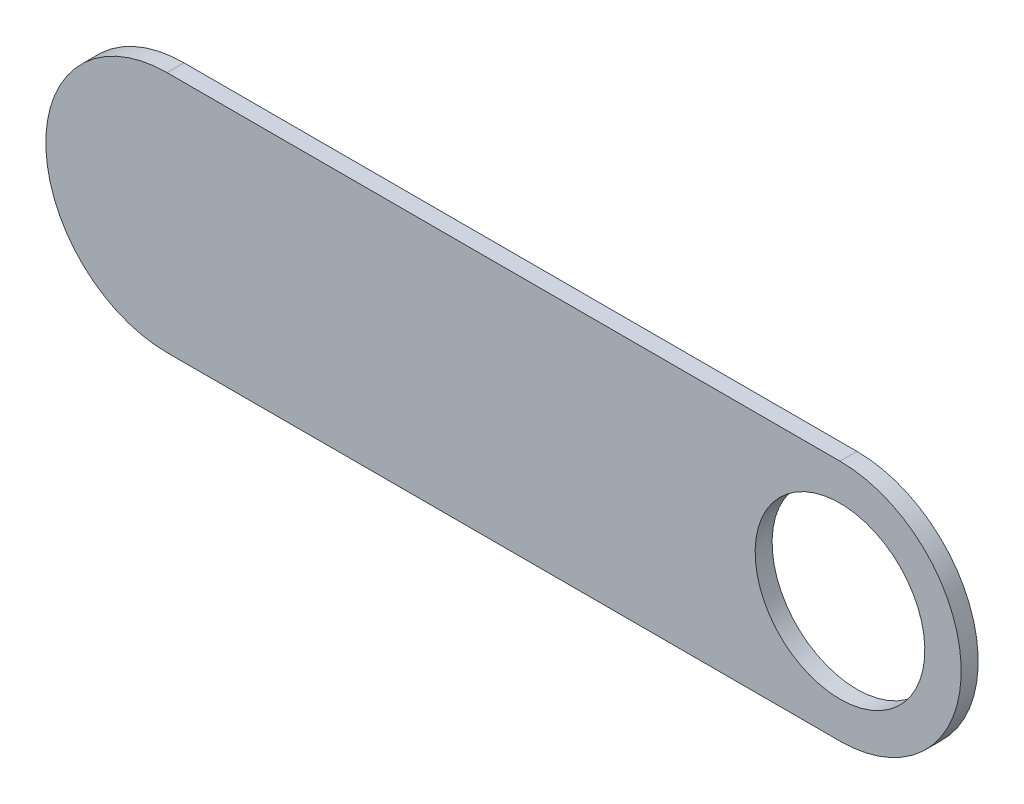
ISO-10303-21;
HEADER;
FILE_DESCRIPTION(('STEP AP214'),'2;1');
FILE_NAME('part.step','',(''),(''),'','','');
FILE_SCHEMA(('AUTOMOTIVE_DESIGN { 1 0 10303 214 1 1 1 1 }'));
ENDSEC;
DATA;
#1=APPLICATION_CONTEXT('core data for automotive mechanical design processes');
#2=APPLICATION_PROTOCOL_DEFINITION('international standard','automotive_design',2000,#1);
#3=PRODUCT_CONTEXT('',#1,'mechanical');
#4=PRODUCT('Part','Part','',(#3));
#5=PRODUCT_RELATED_PRODUCT_CATEGORY('part','',(#4));
#6=PRODUCT_DEFINITION_FORMATION('','',#4);
#7=PRODUCT_DEFINITION_CONTEXT('part definition',#1,'design');
#8=PRODUCT_DEFINITION('design','',#6,#7);
#9=PRODUCT_DEFINITION_SHAPE('','',#8);
#10=(LENGTH_UNIT() NAMED_UNIT(*) SI_UNIT(.MILLI.,.METRE.));
#11=(NAMED_UNIT(*) PLANE_ANGLE_UNIT() SI_UNIT($,.RADIAN.));
#12=(NAMED_UNIT(*) SI_UNIT($,.STERADIAN.) SOLID_ANGLE_UNIT());
#13=UNCERTAINTY_MEASURE_WITH_UNIT(LENGTH_MEASURE(1.E-05),#10,'distance_accuracy_value','');
#14=(GEOMETRIC_REPRESENTATION_CONTEXT(3) GLOBAL_UNCERTAINTY_ASSIGNED_CONTEXT((#13)) GLOBAL_UNIT_ASSIGNED_CONTEXT((#10,
#11,#12)) REPRESENTATION_CONTEXT('',''));
#15=CARTESIAN_POINT('',(0.,0.,0.));
#16=DIRECTION('',(0.,0.,1.));
#17=DIRECTION('',(1.,0.,0.));
#18=AXIS2_PLACEMENT_3D('',#15,#16,#17);
#19=CARTESIAN_POINT('',(132.898812,-72.391188,-0.045));
#20=DIRECTION('',(0.,0.,-1.));
#21=DIRECTION('',(-1.624097681738E-13,-1.,0.));
#22=AXIS2_PLACEMENT_3D('',#19,#20,#21);
#23=CYLINDRICAL_SURFACE('',#22,0.175);
#24=CARTESIAN_POINT('',(132.898812,-72.391188,1.6));
#25=DIRECTION('',(0.,0.,-1.));
#26=DIRECTION('',(-1.624097681738E-13,-1.,0.));
#27=AXIS2_PLACEMENT_3D('',#24,#25,#26);
#28=CIRCLE('',#27,0.175);
#29=CARTESIAN_POINT('',(132.898812,-72.566188,1.6));
#30=VERTEX_POINT('',#29);
#31=EDGE_CURVE('E75',#30,#30,#28,.T.);
#32=ORIENTED_EDGE('',*,*,#31,.T.);
#33=DIRECTION('',(0.,0.,1.));
#34=VECTOR('',#33,1.);
#35=CARTESIAN_POINT('',(132.898812,-72.566188,-0.045));
#36=LINE('',#35,#34);
#37=CARTESIAN_POINT('',(132.898812,-72.566188,1.635));
#38=VERTEX_POINT('',#37);
#39=EDGE_CURVE('E11',#30,#38,#36,.T.);
#40=ORIENTED_EDGE('',*,*,#39,.T.);
#41=CARTESIAN_POINT('',(132.898812,-72.391188,1.635));
#42=DIRECTION('',(0.,0.,-1.));
#43=DIRECTION('',(-1.624097681738E-13,-1.,0.));
#44=AXIS2_PLACEMENT_3D('',#41,#42,#43);
#45=CIRCLE('',#44,0.175);
#46=EDGE_CURVE('E20',#38,#38,#45,.T.);
#47=ORIENTED_EDGE('',*,*,#46,.F.);
#48=ORIENTED_EDGE('',*,*,#39,.F.);
#49=EDGE_LOOP('',(#32,#40,#47,#48));
#50=FACE_BOUND('',#49,.T.);
#51=ADVANCED_FACE('F17',(#50),#23,.F.);
#52=CARTESIAN_POINT('',(131.511188,-72.641188,1.6));
#53=DIRECTION('',(0.,1.,0.));
#54=DIRECTION('',(1.,0.,0.));
#55=AXIS2_PLACEMENT_3D('',#52,#53,#54);
#56=PLANE('',#55);
#57=DIRECTION('',(1.,0.,0.));
#58=VECTOR('',#57,1.);
#59=CARTESIAN_POINT('',(131.511188,-72.641188,1.6));
#60=LINE('',#59,#58);
#61=CARTESIAN_POINT('',(131.511188,-72.641188,1.6));
#62=VERTEX_POINT('',#61);
#63=CARTESIAN_POINT('',(132.898812,-72.641188,1.6));
#64=VERTEX_POINT('',#63);
#65=EDGE_CURVE('E56',#62,#64,#60,.T.);
#66=ORIENTED_EDGE('',*,*,#65,.T.);
#67=DIRECTION('',(0.,0.,1.));
#68=VECTOR('',#67,1.);
#69=CARTESIAN_POINT('',(132.898812,-72.641188,1.6));
#70=LINE('',#69,#68);
#71=CARTESIAN_POINT('',(132.898812,-72.641188,1.635));
#72=VERTEX_POINT('',#71);
#73=EDGE_CURVE('E70',#64,#72,#70,.T.);
#74=ORIENTED_EDGE('',*,*,#73,.T.);
#75=DIRECTION('',(1.,0.,0.));
#76=VECTOR('',#75,1.);
#77=CARTESIAN_POINT('',(131.511188,-72.641188,1.635));
#78=LINE('',#77,#76);
#79=CARTESIAN_POINT('',(131.511188,-72.641188,1.635));
#80=VERTEX_POINT('',#79);
#81=EDGE_CURVE('E63',#80,#72,#78,.T.);
#82=ORIENTED_EDGE('',*,*,#81,.F.);
#83=DIRECTION('',(0.,0.,1.));
#84=VECTOR('',#83,1.);
#85=CARTESIAN_POINT('',(131.511188,-72.641188,1.6));
#86=LINE('',#85,#84);
#87=EDGE_CURVE('E67',#62,#80,#86,.T.);
#88=ORIENTED_EDGE('',*,*,#87,.F.);
#89=EDGE_LOOP('',(#66,#74,#82,#88));
#90=FACE_BOUND('',#89,.T.);
#91=ADVANCED_FACE('F65',(#90),#56,.F.);
#92=CARTESIAN_POINT('',(132.898812,-72.141188,1.635));
#93=DIRECTION('',(0.,0.,1.));
#94=DIRECTION('',(1.,0.,0.));
#95=AXIS2_PLACEMENT_3D('',#92,#93,#94);
#96=PLANE('',#95);
#97=ORIENTED_EDGE('',*,*,#46,.T.);
#98=EDGE_LOOP('',(#97));
#99=FACE_BOUND('',#98,.T.);
#100=DIRECTION('',(-1.,0.,0.));
#101=VECTOR('',#100,1.);
#102=CARTESIAN_POINT('',(132.898812,-72.141188,1.635));
#103=LINE('',#102,#101);
#104=CARTESIAN_POINT('',(132.898812,-72.141188,1.635));
#105=VERTEX_POINT('',#104);
#106=CARTESIAN_POINT('',(131.511188,-72.141188,1.635));
#107=VERTEX_POINT('',#106);
#108=EDGE_CURVE('E83',#105,#107,#103,.T.);
#109=ORIENTED_EDGE('',*,*,#108,.T.);
#110=CARTESIAN_POINT('',(131.511188,-72.391188,1.635));
#111=DIRECTION('',(0.,0.,1.));
#112=DIRECTION('',(0.,1.,0.));
#113=AXIS2_PLACEMENT_3D('',#110,#111,#112);
#114=CIRCLE('',#113,0.25);
#115=EDGE_CURVE('E79',#107,#80,#114,.T.);
#116=ORIENTED_EDGE('',*,*,#115,.T.);
#117=ORIENTED_EDGE('',*,*,#81,.T.);
#118=CARTESIAN_POINT('',(132.898812,-72.391188,1.635));
#119=DIRECTION('',(0.,0.,1.));
#120=DIRECTION('',(0.,-1.,0.));
#121=AXIS2_PLACEMENT_3D('',#118,#119,#120);
#122=CIRCLE('',#121,0.25);
#123=EDGE_CURVE('E105',#72,#105,#122,.T.);
#124=ORIENTED_EDGE('',*,*,#123,.T.);
#125=EDGE_LOOP('',(#109,#116,#117,#124));
#126=FACE_BOUND('',#125,.T.);
#127=ADVANCED_FACE('F80',(#99,#126),#96,.T.);
#128=CARTESIAN_POINT('',(132.898812,-72.141188,1.6));
#129=DIRECTION('',(0.,0.,1.));
#130=DIRECTION('',(1.,0.,0.));
#131=AXIS2_PLACEMENT_3D('',#128,#129,#130);
#132=PLANE('',#131);
#133=ORIENTED_EDGE('',*,*,#31,.F.);
#134=EDGE_LOOP('',(#133));
#135=FACE_BOUND('',#134,.T.);
#136=CARTESIAN_POINT('',(132.898812,-72.391188,1.6));
#137=DIRECTION('',(0.,0.,1.));
#138=DIRECTION('',(0.,-1.,0.));
#139=AXIS2_PLACEMENT_3D('',#136,#137,#138);
#140=CIRCLE('',#139,0.25);
#141=CARTESIAN_POINT('',(132.898812,-72.141188,1.6));
#142=VERTEX_POINT('',#141);
#143=EDGE_CURVE('E101',#64,#142,#140,.T.);
#144=ORIENTED_EDGE('',*,*,#143,.F.);
#145=ORIENTED_EDGE('',*,*,#65,.F.);
#146=CARTESIAN_POINT('',(131.511188,-72.391188,1.6));
#147=DIRECTION('',(0.,0.,1.));
#148=DIRECTION('',(0.,1.,0.));
#149=AXIS2_PLACEMENT_3D('',#146,#147,#148);
#150=CIRCLE('',#149,0.25);
#151=CARTESIAN_POINT('',(131.511188,-72.141188,1.6));
#152=VERTEX_POINT('',#151);
#153=EDGE_CURVE('E90',#152,#62,#150,.T.);
#154=ORIENTED_EDGE('',*,*,#153,.F.);
#155=DIRECTION('',(-1.,0.,0.));
#156=VECTOR('',#155,1.);
#157=CARTESIAN_POINT('',(132.898812,-72.141188,1.6));
#158=LINE('',#157,#156);
#159=EDGE_CURVE('E121',#142,#152,#158,.T.);
#160=ORIENTED_EDGE('',*,*,#159,.F.);
#161=EDGE_LOOP('',(#144,#145,#154,#160));
#162=FACE_BOUND('',#161,.T.);
#163=ADVANCED_FACE('F115',(#135,#162),#132,.F.);
#164=CARTESIAN_POINT('',(131.511188,-72.391188,1.6));
#165=DIRECTION('',(0.,0.,-1.));
#166=DIRECTION('',(0.,1.,0.));
#167=AXIS2_PLACEMENT_3D('',#164,#165,#166);
#168=CYLINDRICAL_SURFACE('',#167,0.25);
#169=ORIENTED_EDGE('',*,*,#153,.T.);
#170=ORIENTED_EDGE('',*,*,#87,.T.);
#171=ORIENTED_EDGE('',*,*,#115,.F.);
#172=DIRECTION('',(0.,0.,1.));
#173=VECTOR('',#172,1.);
#174=CARTESIAN_POINT('',(131.511188,-72.141188,1.6));
#175=LINE('',#174,#173);
#176=EDGE_CURVE('E137',#152,#107,#175,.T.);
#177=ORIENTED_EDGE('',*,*,#176,.F.);
#178=EDGE_LOOP('',(#169,#170,#171,#177));
#179=FACE_BOUND('',#178,.T.);
#180=ADVANCED_FACE('F89',(#179),#168,.T.);
#181=CARTESIAN_POINT('',(132.898812,-72.391188,1.6));
#182=DIRECTION('',(0.,0.,-1.));
#183=DIRECTION('',(0.,-1.,0.));
#184=AXIS2_PLACEMENT_3D('',#181,#182,#183);
#185=CYLINDRICAL_SURFACE('',#184,0.25);
#186=ORIENTED_EDGE('',*,*,#143,.T.);
#187=DIRECTION('',(0.,0.,1.));
#188=VECTOR('',#187,1.);
#189=CARTESIAN_POINT('',(132.898812,-72.141188,1.6));
#190=LINE('',#189,#188);
#191=EDGE_CURVE('E100',#142,#105,#190,.T.);
#192=ORIENTED_EDGE('',*,*,#191,.T.);
#193=ORIENTED_EDGE('',*,*,#123,.F.);
#194=ORIENTED_EDGE('',*,*,#73,.F.);
#195=EDGE_LOOP('',(#186,#192,#193,#194));
#196=FACE_BOUND('',#195,.T.);
#197=ADVANCED_FACE('F127',(#196),#185,.T.);
#198=CARTESIAN_POINT('',(132.898812,-72.141188,1.6));
#199=DIRECTION('',(0.,-1.,0.));
#200=DIRECTION('',(0.,0.,-1.));
#201=AXIS2_PLACEMENT_3D('',#198,#199,#200);
#202=PLANE('',#201);
#203=ORIENTED_EDGE('',*,*,#159,.T.);
#204=ORIENTED_EDGE('',*,*,#176,.T.);
#205=ORIENTED_EDGE('',*,*,#108,.F.);
#206=ORIENTED_EDGE('',*,*,#191,.F.);
#207=EDGE_LOOP('',(#203,#204,#205,#206));
#208=FACE_BOUND('',#207,.T.);
#209=ADVANCED_FACE('F132',(#208),#202,.F.);
#210=CLOSED_SHELL('',(#51,#91,#127,#163,#180,#197,#209));
#211=MANIFOLD_SOLID_BREP('B1',#210);
#212=ADVANCED_BREP_SHAPE_REPRESENTATION('',(#18,#211),#14);
#213=SHAPE_DEFINITION_REPRESENTATION(#9,#212);
ENDSEC;
END-ISO-10303-21;
